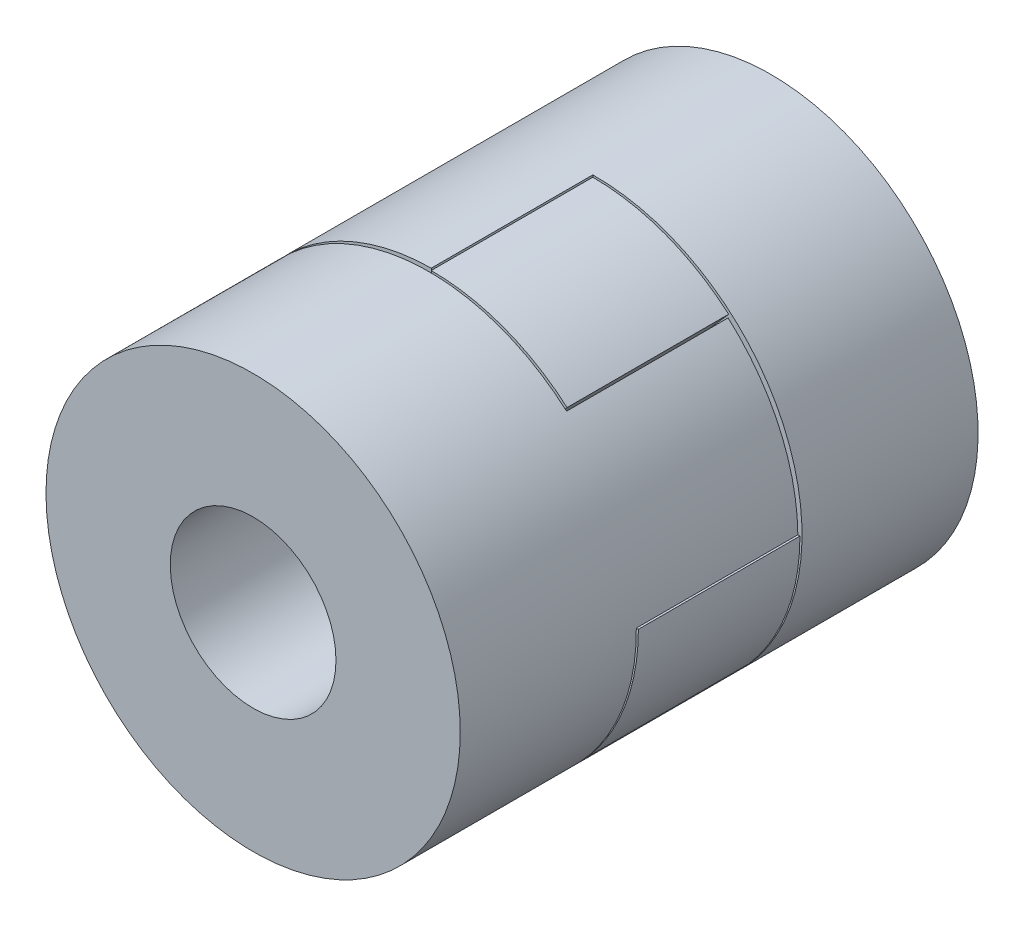
ISO-10303-21;
HEADER;
FILE_DESCRIPTION(('STEP AP214'),'2;1');
FILE_NAME('part.step','',(''),(''),'','','');
FILE_SCHEMA(('AUTOMOTIVE_DESIGN { 1 0 10303 214 1 1 1 1 }'));
ENDSEC;
DATA;
#1=APPLICATION_CONTEXT('core data for automotive mechanical design processes');
#2=APPLICATION_PROTOCOL_DEFINITION('international standard','automotive_design',2000,#1);
#3=PRODUCT_CONTEXT('',#1,'mechanical');
#4=PRODUCT('Part','Part','',(#3));
#5=PRODUCT_RELATED_PRODUCT_CATEGORY('part','',(#4));
#6=PRODUCT_DEFINITION_FORMATION('','',#4);
#7=PRODUCT_DEFINITION_CONTEXT('part definition',#1,'design');
#8=PRODUCT_DEFINITION('design','',#6,#7);
#9=PRODUCT_DEFINITION_SHAPE('','',#8);
#10=(LENGTH_UNIT() NAMED_UNIT(*) SI_UNIT(.MILLI.,.METRE.));
#11=(NAMED_UNIT(*) PLANE_ANGLE_UNIT() SI_UNIT($,.RADIAN.));
#12=(NAMED_UNIT(*) SI_UNIT($,.STERADIAN.) SOLID_ANGLE_UNIT());
#13=UNCERTAINTY_MEASURE_WITH_UNIT(LENGTH_MEASURE(1.E-05),#10,'distance_accuracy_value','');
#14=(GEOMETRIC_REPRESENTATION_CONTEXT(3) GLOBAL_UNCERTAINTY_ASSIGNED_CONTEXT((#13)) GLOBAL_UNIT_ASSIGNED_CONTEXT((#10,
#11,#12)) REPRESENTATION_CONTEXT('',''));
#15=CARTESIAN_POINT('',(0.,0.,0.));
#16=DIRECTION('',(0.,0.,1.));
#17=DIRECTION('',(1.,0.,0.));
#18=AXIS2_PLACEMENT_3D('',#15,#16,#17);
#19=CARTESIAN_POINT('',(0.,0.,-4.));
#20=DIRECTION('',(0.,0.,-1.));
#21=DIRECTION('',(-1.,0.,0.));
#22=AXIS2_PLACEMENT_3D('',#19,#20,#21);
#23=PLANE('',#22);
#24=DIRECTION('',(0.754999999999998,-0.655724789831835,0.));
#25=VECTOR('',#24,1.);
#26=CARTESIAN_POINT('',(-0.0999999999999948,0.219301296666478,-4.));
#27=LINE('',#26,#25);
#28=CARTESIAN_POINT('',(-7.48405001157881,6.63242002772647,-4.));
#29=VERTEX_POINT('',#28);
#30=CARTESIAN_POINT('',(-1.82041691653312,1.71350000000001,-4.));
#31=VERTEX_POINT('',#30);
#32=EDGE_CURVE('E125',#29,#31,#27,.T.);
#33=ORIENTED_EDGE('',*,*,#32,.F.);
#34=CARTESIAN_POINT('',(0.,0.,-4.));
#35=DIRECTION('',(0.,0.,-1.));
#36=DIRECTION('',(-1.,0.,0.));
#37=AXIS2_PLACEMENT_3D('',#34,#35,#36);
#38=CIRCLE('',#37,10.);
#39=CARTESIAN_POINT('',(0.100000000000002,-9.99949998749938,-4.));
#40=VERTEX_POINT('',#39);
#41=EDGE_CURVE('E96',#40,#29,#38,.T.);
#42=ORIENTED_EDGE('',*,*,#41,.F.);
#43=DIRECTION('',(0.,-1.,0.));
#44=VECTOR('',#43,1.);
#45=CARTESIAN_POINT('',(0.1,-0.219301296666469,-4.));
#46=LINE('',#45,#44);
#47=CARTESIAN_POINT('',(0.100000000000001,-2.49799919935936,-4.));
#48=VERTEX_POINT('',#47);
#49=EDGE_CURVE('E13',#48,#40,#46,.T.);
#50=ORIENTED_EDGE('',*,*,#49,.F.);
#51=CARTESIAN_POINT('',(0.,0.,-4.));
#52=DIRECTION('',(0.,0.,-1.));
#53=DIRECTION('',(-1.,0.,0.));
#54=AXIS2_PLACEMENT_3D('',#51,#52,#53);
#55=CIRCLE('',#54,2.5);
#56=EDGE_CURVE('E245',#48,#31,#55,.T.);
#57=ORIENTED_EDGE('',*,*,#56,.T.);
#58=EDGE_LOOP('',(#33,#42,#50,#57));
#59=FACE_BOUND('',#58,.T.);
#60=ADVANCED_FACE('F92',(#59),#23,.F.);
#61=DIRECTION('',(0.,1.,0.));
#62=VECTOR('',#61,1.);
#63=CARTESIAN_POINT('',(-0.0999999999999948,0.219301296666478,-4.));
#64=LINE('',#63,#62);
#65=CARTESIAN_POINT('',(-0.0999999999999935,2.49799919935936,-4.));
#66=VERTEX_POINT('',#65);
#67=CARTESIAN_POINT('',(-0.0999999999999889,9.99949998749938,-4.));
#68=VERTEX_POINT('',#67);
#69=EDGE_CURVE('E353',#66,#68,#64,.T.);
#70=ORIENTED_EDGE('',*,*,#69,.F.);
#71=CARTESIAN_POINT('',(1.82041691653313,-1.71350000000001,-4.));
#72=VERTEX_POINT('',#71);
#73=EDGE_CURVE('E237',#66,#72,#55,.T.);
#74=ORIENTED_EDGE('',*,*,#73,.T.);
#75=DIRECTION('',(-0.754999999999998,0.655724789831834,0.));
#76=VECTOR('',#75,1.);
#77=CARTESIAN_POINT('',(0.1,-0.219301296666469,-4.));
#78=LINE('',#77,#76);
#79=CARTESIAN_POINT('',(7.48405001157882,-6.63242002772646,-4.));
#80=VERTEX_POINT('',#79);
#81=EDGE_CURVE('E206',#80,#72,#78,.T.);
#82=ORIENTED_EDGE('',*,*,#81,.F.);
#83=EDGE_CURVE('E114',#68,#80,#38,.T.);
#84=ORIENTED_EDGE('',*,*,#83,.F.);
#85=EDGE_LOOP('',(#70,#74,#82,#84));
#86=FACE_BOUND('',#85,.T.);
#87=ADVANCED_FACE('F254',(#86),#23,.F.);
#88=CARTESIAN_POINT('',(0.,0.,-12.5));
#89=DIRECTION('',(0.,0.,-1.));
#90=DIRECTION('',(-1.,0.,0.));
#91=AXIS2_PLACEMENT_3D('',#88,#89,#90);
#92=PLANE('',#91);
#93=CARTESIAN_POINT('',(0.,0.,-12.5));
#94=DIRECTION('',(0.,0.,-1.));
#95=DIRECTION('',(-1.,0.,0.));
#96=AXIS2_PLACEMENT_3D('',#93,#94,#95);
#97=CIRCLE('',#96,10.);
#98=CARTESIAN_POINT('',(-10.,0.,-12.5));
#99=VERTEX_POINT('',#98);
#100=EDGE_CURVE('E102',#99,#99,#97,.T.);
#101=ORIENTED_EDGE('',*,*,#100,.T.);
#102=EDGE_LOOP('',(#101));
#103=FACE_BOUND('',#102,.T.);
#104=CARTESIAN_POINT('',(0.,0.,-12.5));
#105=DIRECTION('',(0.,0.,-1.));
#106=DIRECTION('',(-1.,0.,0.));
#107=AXIS2_PLACEMENT_3D('',#104,#105,#106);
#108=CIRCLE('',#107,2.5);
#109=CARTESIAN_POINT('',(-2.5,0.,-12.5));
#110=VERTEX_POINT('',#109);
#111=EDGE_CURVE('E238',#110,#110,#108,.T.);
#112=ORIENTED_EDGE('',*,*,#111,.F.);
#113=EDGE_LOOP('',(#112));
#114=FACE_BOUND('',#113,.T.);
#115=ADVANCED_FACE('F291',(#103,#114),#92,.T.);
#116=CARTESIAN_POINT('',(0.,0.,-12.5));
#117=DIRECTION('',(0.,0.,1.));
#118=DIRECTION('',(1.,0.,0.));
#119=AXIS2_PLACEMENT_3D('',#116,#117,#118);
#120=CYLINDRICAL_SURFACE('',#119,10.);
#121=ORIENTED_EDGE('',*,*,#100,.F.);
#122=EDGE_LOOP('',(#121));
#123=FACE_BOUND('',#122,.T.);
#124=ORIENTED_EDGE('',*,*,#41,.T.);
#125=DIRECTION('',(0.,0.,-1.));
#126=VECTOR('',#125,1.);
#127=CARTESIAN_POINT('',(-7.48405001157882,6.63242002772647,3.8));
#128=LINE('',#127,#126);
#129=CARTESIAN_POINT('',(-7.48405001157882,6.63242002772647,3.8));
#130=VERTEX_POINT('',#129);
#131=EDGE_CURVE('E183',#130,#29,#128,.T.);
#132=ORIENTED_EDGE('',*,*,#131,.F.);
#133=CARTESIAN_POINT('',(0.,0.,3.8));
#134=DIRECTION('',(0.,0.,1.));
#135=DIRECTION('',(1.,0.,0.));
#136=AXIS2_PLACEMENT_3D('',#133,#134,#135);
#137=CIRCLE('',#136,10.);
#138=CARTESIAN_POINT('',(-0.099999999999989,9.99949998749938,3.8));
#139=VERTEX_POINT('',#138);
#140=EDGE_CURVE('E190',#139,#130,#137,.T.);
#141=ORIENTED_EDGE('',*,*,#140,.F.);
#142=DIRECTION('',(0.,0.,-1.));
#143=VECTOR('',#142,1.);
#144=CARTESIAN_POINT('',(-0.099999999999989,9.99949998749938,3.8));
#145=LINE('',#144,#143);
#146=EDGE_CURVE('E208',#139,#68,#145,.T.);
#147=ORIENTED_EDGE('',*,*,#146,.T.);
#148=ORIENTED_EDGE('',*,*,#83,.T.);
#149=DIRECTION('',(0.,0.,-1.));
#150=VECTOR('',#149,1.);
#151=CARTESIAN_POINT('',(7.48405001157882,-6.63242002772646,3.8));
#152=LINE('',#151,#150);
#153=CARTESIAN_POINT('',(7.48405001157882,-6.63242002772646,3.8));
#154=VERTEX_POINT('',#153);
#155=EDGE_CURVE('E233',#154,#80,#152,.T.);
#156=ORIENTED_EDGE('',*,*,#155,.F.);
#157=CARTESIAN_POINT('',(0.,0.,3.8));
#158=DIRECTION('',(0.,0.,1.));
#159=DIRECTION('',(-1.,0.,0.));
#160=AXIS2_PLACEMENT_3D('',#157,#158,#159);
#161=CIRCLE('',#160,10.);
#162=CARTESIAN_POINT('',(0.100000000000002,-9.99949998749938,3.8));
#163=VERTEX_POINT('',#162);
#164=EDGE_CURVE('E212',#163,#154,#161,.T.);
#165=ORIENTED_EDGE('',*,*,#164,.F.);
#166=DIRECTION('',(0.,0.,-1.));
#167=VECTOR('',#166,1.);
#168=CARTESIAN_POINT('',(0.100000000000002,-9.99949998749938,3.8));
#169=LINE('',#168,#167);
#170=EDGE_CURVE('E221',#163,#40,#169,.T.);
#171=ORIENTED_EDGE('',*,*,#170,.T.);
#172=EDGE_LOOP('',(#124,#132,#141,#147,#148,#156,#165,#171));
#173=FACE_BOUND('',#172,.T.);
#174=ADVANCED_FACE('F94',(#123,#173),#120,.T.);
#175=CARTESIAN_POINT('',(0.,0.,-12.5));
#176=DIRECTION('',(0.,0.,1.));
#177=DIRECTION('',(1.,0.,0.));
#178=AXIS2_PLACEMENT_3D('',#175,#176,#177);
#179=CYLINDRICAL_SURFACE('',#178,2.5);
#180=ORIENTED_EDGE('',*,*,#111,.T.);
#181=EDGE_LOOP('',(#180));
#182=FACE_BOUND('',#181,.T.);
#183=EDGE_CURVE('E242',#72,#48,#55,.T.);
#184=ORIENTED_EDGE('',*,*,#183,.F.);
#185=ORIENTED_EDGE('',*,*,#73,.F.);
#186=EDGE_CURVE('E272',#31,#66,#55,.T.);
#187=ORIENTED_EDGE('',*,*,#186,.F.);
#188=ORIENTED_EDGE('',*,*,#56,.F.);
#189=EDGE_LOOP('',(#184,#185,#187,#188));
#190=FACE_BOUND('',#189,.T.);
#191=ADVANCED_FACE('F269',(#182,#190),#179,.F.);
#192=CARTESIAN_POINT('',(0.1,-0.219301296666469,3.8));
#193=DIRECTION('',(-0.655724789831834,-0.754999999999998,0.));
#194=DIRECTION('',(0.754999999999998,-0.655724789831834,0.));
#195=AXIS2_PLACEMENT_3D('',#192,#193,#194);
#196=PLANE('',#195);
#197=ORIENTED_EDGE('',*,*,#81,.T.);
#198=CARTESIAN_POINT('',(0.1,-0.219301296666469,-4.));
#199=VERTEX_POINT('',#198);
#200=EDGE_CURVE('E202',#72,#199,#78,.T.);
#201=ORIENTED_EDGE('',*,*,#200,.T.);
#202=DIRECTION('',(0.,0.,-1.));
#203=VECTOR('',#202,1.);
#204=CARTESIAN_POINT('',(0.1,-0.219301296666469,3.8));
#205=LINE('',#204,#203);
#206=CARTESIAN_POINT('',(0.1,-0.219301296666469,3.8));
#207=VERTEX_POINT('',#206);
#208=EDGE_CURVE('E229',#207,#199,#205,.T.);
#209=ORIENTED_EDGE('',*,*,#208,.F.);
#210=DIRECTION('',(-0.754999999999998,0.655724789831834,0.));
#211=VECTOR('',#210,1.);
#212=CARTESIAN_POINT('',(0.1,-0.219301296666469,3.8));
#213=LINE('',#212,#211);
#214=EDGE_CURVE('E216',#154,#207,#213,.T.);
#215=ORIENTED_EDGE('',*,*,#214,.F.);
#216=ORIENTED_EDGE('',*,*,#155,.T.);
#217=EDGE_LOOP('',(#197,#201,#209,#215,#216));
#218=FACE_BOUND('',#217,.T.);
#219=ADVANCED_FACE('F257',(#218),#196,.F.);
#220=CARTESIAN_POINT('',(0.1,-0.219301296666469,3.8));
#221=DIRECTION('',(1.,0.,0.));
#222=DIRECTION('',(0.,1.,0.));
#223=AXIS2_PLACEMENT_3D('',#220,#221,#222);
#224=PLANE('',#223);
#225=EDGE_CURVE('E104',#199,#48,#46,.T.);
#226=ORIENTED_EDGE('',*,*,#225,.T.);
#227=ORIENTED_EDGE('',*,*,#49,.T.);
#228=ORIENTED_EDGE('',*,*,#170,.F.);
#229=DIRECTION('',(0.,-1.,0.));
#230=VECTOR('',#229,1.);
#231=CARTESIAN_POINT('',(0.1,-0.219301296666469,3.8));
#232=LINE('',#231,#230);
#233=EDGE_CURVE('E219',#207,#163,#232,.T.);
#234=ORIENTED_EDGE('',*,*,#233,.F.);
#235=ORIENTED_EDGE('',*,*,#208,.T.);
#236=EDGE_LOOP('',(#226,#227,#228,#234,#235));
#237=FACE_BOUND('',#236,.T.);
#238=ADVANCED_FACE('F264',(#237),#224,.F.);
#239=CARTESIAN_POINT('',(0.,0.,3.8));
#240=DIRECTION('',(0.,0.,-1.));
#241=DIRECTION('',(-1.,0.,0.));
#242=AXIS2_PLACEMENT_3D('',#239,#240,#241);
#243=PLANE('',#242);
#244=ORIENTED_EDGE('',*,*,#164,.T.);
#245=ORIENTED_EDGE('',*,*,#214,.T.);
#246=ORIENTED_EDGE('',*,*,#233,.T.);
#247=EDGE_LOOP('',(#244,#245,#246));
#248=FACE_BOUND('',#247,.T.);
#249=ADVANCED_FACE('F261',(#248),#243,.F.);
#250=CARTESIAN_POINT('',(0.,0.,-4.));
#251=DIRECTION('',(0.,0.,-1.));
#252=DIRECTION('',(-1.,0.,0.));
#253=AXIS2_PLACEMENT_3D('',#250,#251,#252);
#254=PLANE('',#253);
#255=ORIENTED_EDGE('',*,*,#200,.F.);
#256=ORIENTED_EDGE('',*,*,#183,.T.);
#257=ORIENTED_EDGE('',*,*,#225,.F.);
#258=EDGE_LOOP('',(#255,#256,#257));
#259=FACE_BOUND('',#258,.T.);
#260=ADVANCED_FACE('F275',(#259),#254,.T.);
#261=CARTESIAN_POINT('',(0.,0.,-4.));
#262=DIRECTION('',(0.,0.,1.));
#263=DIRECTION('',(1.,0.,0.));
#264=AXIS2_PLACEMENT_3D('',#261,#262,#263);
#265=PLANE('',#264);
#266=ORIENTED_EDGE('',*,*,#186,.T.);
#267=CARTESIAN_POINT('',(-0.0999999999999948,0.219301296666478,-4.));
#268=VERTEX_POINT('',#267);
#269=EDGE_CURVE('E198',#268,#66,#64,.T.);
#270=ORIENTED_EDGE('',*,*,#269,.F.);
#271=EDGE_CURVE('E362',#31,#268,#27,.T.);
#272=ORIENTED_EDGE('',*,*,#271,.F.);
#273=EDGE_LOOP('',(#266,#270,#272));
#274=FACE_BOUND('',#273,.T.);
#275=ADVANCED_FACE('F277',(#274),#265,.F.);
#276=CARTESIAN_POINT('',(-0.0999999999999948,0.219301296666478,3.8));
#277=DIRECTION('',(0.655724789831835,0.754999999999998,0.));
#278=DIRECTION('',(-0.754999999999998,0.655724789831835,0.));
#279=AXIS2_PLACEMENT_3D('',#276,#277,#278);
#280=PLANE('',#279);
#281=ORIENTED_EDGE('',*,*,#32,.T.);
#282=ORIENTED_EDGE('',*,*,#271,.T.);
#283=DIRECTION('',(0.,0.,-1.));
#284=VECTOR('',#283,1.);
#285=CARTESIAN_POINT('',(-0.0999999999999948,0.219301296666478,3.8));
#286=LINE('',#285,#284);
#287=CARTESIAN_POINT('',(-0.0999999999999948,0.219301296666478,3.8));
#288=VERTEX_POINT('',#287);
#289=EDGE_CURVE('E185',#288,#268,#286,.T.);
#290=ORIENTED_EDGE('',*,*,#289,.F.);
#291=DIRECTION('',(0.754999999999998,-0.655724789831835,0.));
#292=VECTOR('',#291,1.);
#293=CARTESIAN_POINT('',(-0.0999999999999948,0.219301296666478,3.8));
#294=LINE('',#293,#292);
#295=EDGE_CURVE('E179',#130,#288,#294,.T.);
#296=ORIENTED_EDGE('',*,*,#295,.F.);
#297=ORIENTED_EDGE('',*,*,#131,.T.);
#298=EDGE_LOOP('',(#281,#282,#290,#296,#297));
#299=FACE_BOUND('',#298,.T.);
#300=ADVANCED_FACE('F181',(#299),#280,.F.);
#301=CARTESIAN_POINT('',(-0.0999999999999948,0.219301296666478,3.8));
#302=DIRECTION('',(-1.,0.,0.));
#303=DIRECTION('',(0.,-1.,0.));
#304=AXIS2_PLACEMENT_3D('',#301,#302,#303);
#305=PLANE('',#304);
#306=ORIENTED_EDGE('',*,*,#269,.T.);
#307=ORIENTED_EDGE('',*,*,#69,.T.);
#308=ORIENTED_EDGE('',*,*,#146,.F.);
#309=DIRECTION('',(0.,1.,0.));
#310=VECTOR('',#309,1.);
#311=CARTESIAN_POINT('',(-0.0999999999999948,0.219301296666478,3.8));
#312=LINE('',#311,#310);
#313=EDGE_CURVE('E189',#288,#139,#312,.T.);
#314=ORIENTED_EDGE('',*,*,#313,.F.);
#315=ORIENTED_EDGE('',*,*,#289,.T.);
#316=EDGE_LOOP('',(#306,#307,#308,#314,#315));
#317=FACE_BOUND('',#316,.T.);
#318=ADVANCED_FACE('F329',(#317),#305,.F.);
#319=CARTESIAN_POINT('',(0.,0.,3.8));
#320=DIRECTION('',(0.,0.,1.));
#321=DIRECTION('',(1.,0.,0.));
#322=AXIS2_PLACEMENT_3D('',#319,#320,#321);
#323=PLANE('',#322);
#324=ORIENTED_EDGE('',*,*,#140,.T.);
#325=ORIENTED_EDGE('',*,*,#295,.T.);
#326=ORIENTED_EDGE('',*,*,#313,.T.);
#327=EDGE_LOOP('',(#324,#325,#326));
#328=FACE_BOUND('',#327,.T.);
#329=ADVANCED_FACE('F193',(#328),#323,.T.);
#330=CLOSED_SHELL('',(#60,#87,#115,#174,#191,#219,#238,#249,#260,#275,#300,#318,#329));
#331=MANIFOLD_SOLID_BREP('B2',#330);
#332=CARTESIAN_POINT('',(0.,0.,4.));
#333=DIRECTION('',(0.,0.,1.));
#334=DIRECTION('',(1.,0.,0.));
#335=AXIS2_PLACEMENT_3D('',#332,#333,#334);
#336=PLANE('',#335);
#337=DIRECTION('',(-1.,0.,0.));
#338=VECTOR('',#337,1.);
#339=CARTESIAN_POINT('',(0.219301296666467,0.100000000000001,4.));
#340=LINE('',#339,#338);
#341=CARTESIAN_POINT('',(9.99949998749938,0.100000000000001,4.));
#342=VERTEX_POINT('',#341);
#343=CARTESIAN_POINT('',(3.99874980462644,0.100000000000001,4.));
#344=VERTEX_POINT('',#343);
#345=EDGE_CURVE('E457',#342,#344,#340,.T.);
#346=ORIENTED_EDGE('',*,*,#345,.F.);
#347=CARTESIAN_POINT('',(0.,0.,4.));
#348=DIRECTION('',(0.,0.,1.));
#349=DIRECTION('',(1.,0.,0.));
#350=AXIS2_PLACEMENT_3D('',#347,#348,#349);
#351=CIRCLE('',#350,10.);
#352=CARTESIAN_POINT('',(-6.63242002772648,-7.48405001157881,4.));
#353=VERTEX_POINT('',#352);
#354=EDGE_CURVE('E428',#353,#342,#351,.T.);
#355=ORIENTED_EDGE('',*,*,#354,.F.);
#356=DIRECTION('',(-0.655724789831836,-0.754999999999997,0.));
#357=VECTOR('',#356,1.);
#358=CARTESIAN_POINT('',(-0.219301296666469,-0.0999999999999946,4.));
#359=LINE('',#358,#357);
#360=CARTESIAN_POINT('',(-2.69757937522877,-2.95348362350976,4.));
#361=VERTEX_POINT('',#360);
#362=EDGE_CURVE('E90',#361,#353,#359,.T.);
#363=ORIENTED_EDGE('',*,*,#362,.F.);
#364=CARTESIAN_POINT('',(0.,0.,4.));
#365=DIRECTION('',(0.,0.,1.));
#366=DIRECTION('',(1.,0.,0.));
#367=AXIS2_PLACEMENT_3D('',#364,#365,#366);
#368=CIRCLE('',#367,4.);
#369=EDGE_CURVE('E575',#361,#344,#368,.T.);
#370=ORIENTED_EDGE('',*,*,#369,.T.);
#371=EDGE_LOOP('',(#346,#355,#363,#370));
#372=FACE_BOUND('',#371,.T.);
#373=ADVANCED_FACE('F424',(#372),#336,.F.);
#374=DIRECTION('',(0.655724789831832,0.755,0.));
#375=VECTOR('',#374,1.);
#376=CARTESIAN_POINT('',(6.63242002772643,7.48405001157885,4.));
#377=LINE('',#376,#375);
#378=CARTESIAN_POINT('',(2.69757937522875,2.95348362350978,4.));
#379=VERTEX_POINT('',#378);
#380=CARTESIAN_POINT('',(6.63242002772643,7.48405001157885,4.));
#381=VERTEX_POINT('',#380);
#382=EDGE_CURVE('E730',#379,#381,#377,.T.);
#383=ORIENTED_EDGE('',*,*,#382,.F.);
#384=CARTESIAN_POINT('',(-3.99874980462644,-0.099999999999974,4.));
#385=VERTEX_POINT('',#384);
#386=EDGE_CURVE('E567',#379,#385,#368,.T.);
#387=ORIENTED_EDGE('',*,*,#386,.T.);
#388=DIRECTION('',(1.,0.,0.));
#389=VECTOR('',#388,1.);
#390=CARTESIAN_POINT('',(-9.99949998749938,-0.0999999999999413,4.));
#391=LINE('',#390,#389);
#392=CARTESIAN_POINT('',(-9.99949998749938,-0.0999999999999413,4.));
#393=VERTEX_POINT('',#392);
#394=EDGE_CURVE('E536',#393,#385,#391,.T.);
#395=ORIENTED_EDGE('',*,*,#394,.F.);
#396=EDGE_CURVE('E446',#381,#393,#351,.T.);
#397=ORIENTED_EDGE('',*,*,#396,.F.);
#398=EDGE_LOOP('',(#383,#387,#395,#397));
#399=FACE_BOUND('',#398,.T.);
#400=ADVANCED_FACE('F585',(#399),#336,.F.);
#401=CARTESIAN_POINT('',(0.,0.,12.5));
#402=DIRECTION('',(0.,0.,1.));
#403=DIRECTION('',(1.,0.,0.));
#404=AXIS2_PLACEMENT_3D('',#401,#402,#403);
#405=PLANE('',#404);
#406=CARTESIAN_POINT('',(0.,0.,12.5));
#407=DIRECTION('',(0.,0.,1.));
#408=DIRECTION('',(1.,0.,0.));
#409=AXIS2_PLACEMENT_3D('',#406,#407,#408);
#410=CIRCLE('',#409,10.);
#411=CARTESIAN_POINT('',(10.,0.,12.5));
#412=VERTEX_POINT('',#411);
#413=EDGE_CURVE('E434',#412,#412,#410,.T.);
#414=ORIENTED_EDGE('',*,*,#413,.T.);
#415=EDGE_LOOP('',(#414));
#416=FACE_BOUND('',#415,.T.);
#417=CARTESIAN_POINT('',(0.,0.,12.5));
#418=DIRECTION('',(0.,0.,1.));
#419=DIRECTION('',(1.,0.,0.));
#420=AXIS2_PLACEMENT_3D('',#417,#418,#419);
#421=CIRCLE('',#420,4.);
#422=CARTESIAN_POINT('',(4.,0.,12.5));
#423=VERTEX_POINT('',#422);
#424=EDGE_CURVE('E568',#423,#423,#421,.T.);
#425=ORIENTED_EDGE('',*,*,#424,.F.);
#426=EDGE_LOOP('',(#425));
#427=FACE_BOUND('',#426,.T.);
#428=ADVANCED_FACE('F622',(#416,#427),#405,.T.);
#429=CARTESIAN_POINT('',(0.,0.,12.5));
#430=DIRECTION('',(0.,0.,-1.));
#431=DIRECTION('',(-1.,0.,0.));
#432=AXIS2_PLACEMENT_3D('',#429,#430,#431);
#433=CYLINDRICAL_SURFACE('',#432,10.);
#434=ORIENTED_EDGE('',*,*,#413,.F.);
#435=EDGE_LOOP('',(#434));
#436=FACE_BOUND('',#435,.T.);
#437=ORIENTED_EDGE('',*,*,#354,.T.);
#438=DIRECTION('',(0.,0.,1.));
#439=VECTOR('',#438,1.);
#440=CARTESIAN_POINT('',(9.99949998749938,0.100000000000001,-3.8));
#441=LINE('',#440,#439);
#442=CARTESIAN_POINT('',(9.99949998749938,0.100000000000001,-3.8));
#443=VERTEX_POINT('',#442);
#444=EDGE_CURVE('E513',#443,#342,#441,.T.);
#445=ORIENTED_EDGE('',*,*,#444,.F.);
#446=CARTESIAN_POINT('',(0.,0.,-3.8));
#447=DIRECTION('',(0.,0.,-1.));
#448=DIRECTION('',(-1.,0.,0.));
#449=AXIS2_PLACEMENT_3D('',#446,#447,#448);
#450=CIRCLE('',#449,10.);
#451=CARTESIAN_POINT('',(6.63242002772643,7.48405001157885,-3.8));
#452=VERTEX_POINT('',#451);
#453=EDGE_CURVE('E520',#452,#443,#450,.T.);
#454=ORIENTED_EDGE('',*,*,#453,.F.);
#455=DIRECTION('',(0.,0.,1.));
#456=VECTOR('',#455,1.);
#457=CARTESIAN_POINT('',(6.63242002772643,7.48405001157885,-3.8));
#458=LINE('',#457,#456);
#459=EDGE_CURVE('E539',#452,#381,#458,.T.);
#460=ORIENTED_EDGE('',*,*,#459,.T.);
#461=ORIENTED_EDGE('',*,*,#396,.T.);
#462=DIRECTION('',(0.,0.,1.));
#463=VECTOR('',#462,1.);
#464=CARTESIAN_POINT('',(-9.99949998749938,-0.0999999999999413,-3.8));
#465=LINE('',#464,#463);
#466=CARTESIAN_POINT('',(-9.99949998749938,-0.0999999999999413,-3.8));
#467=VERTEX_POINT('',#466);
#468=EDGE_CURVE('E564',#467,#393,#465,.T.);
#469=ORIENTED_EDGE('',*,*,#468,.F.);
#470=CARTESIAN_POINT('',(0.,0.,-3.8));
#471=DIRECTION('',(0.,0.,-1.));
#472=DIRECTION('',(1.,0.,0.));
#473=AXIS2_PLACEMENT_3D('',#470,#471,#472);
#474=CIRCLE('',#473,10.);
#475=CARTESIAN_POINT('',(-6.63242002772647,-7.48405001157881,-3.8));
#476=VERTEX_POINT('',#475);
#477=EDGE_CURVE('E543',#476,#467,#474,.T.);
#478=ORIENTED_EDGE('',*,*,#477,.F.);
#479=DIRECTION('',(0.,0.,1.));
#480=VECTOR('',#479,1.);
#481=CARTESIAN_POINT('',(-6.63242002772647,-7.48405001157881,-3.8));
#482=LINE('',#481,#480);
#483=EDGE_CURVE('E552',#476,#353,#482,.T.);
#484=ORIENTED_EDGE('',*,*,#483,.T.);
#485=EDGE_LOOP('',(#437,#445,#454,#460,#461,#469,#478,#484));
#486=FACE_BOUND('',#485,.T.);
#487=ADVANCED_FACE('F426',(#436,#486),#433,.T.);
#488=CARTESIAN_POINT('',(0.,0.,12.5));
#489=DIRECTION('',(0.,0.,-1.));
#490=DIRECTION('',(-1.,0.,0.));
#491=AXIS2_PLACEMENT_3D('',#488,#489,#490);
#492=CYLINDRICAL_SURFACE('',#491,4.);
#493=ORIENTED_EDGE('',*,*,#424,.T.);
#494=EDGE_LOOP('',(#493));
#495=FACE_BOUND('',#494,.T.);
#496=EDGE_CURVE('E572',#385,#361,#368,.T.);
#497=ORIENTED_EDGE('',*,*,#496,.F.);
#498=ORIENTED_EDGE('',*,*,#386,.F.);
#499=EDGE_CURVE('E603',#344,#379,#368,.T.);
#500=ORIENTED_EDGE('',*,*,#499,.F.);
#501=ORIENTED_EDGE('',*,*,#369,.F.);
#502=EDGE_LOOP('',(#497,#498,#500,#501));
#503=FACE_BOUND('',#502,.T.);
#504=ADVANCED_FACE('F600',(#495,#503),#492,.F.);
#505=CARTESIAN_POINT('',(-9.99949998749938,-0.0999999999999413,-3.8));
#506=DIRECTION('',(0.,-1.,0.));
#507=DIRECTION('',(1.,0.,0.));
#508=AXIS2_PLACEMENT_3D('',#505,#506,#507);
#509=PLANE('',#508);
#510=ORIENTED_EDGE('',*,*,#394,.T.);
#511=CARTESIAN_POINT('',(-0.219301296666469,-0.0999999999999946,4.));
#512=VERTEX_POINT('',#511);
#513=EDGE_CURVE('E531',#385,#512,#391,.T.);
#514=ORIENTED_EDGE('',*,*,#513,.T.);
#515=DIRECTION('',(0.,0.,1.));
#516=VECTOR('',#515,1.);
#517=CARTESIAN_POINT('',(-0.219301296666469,-0.0999999999999946,-3.8));
#518=LINE('',#517,#516);
#519=CARTESIAN_POINT('',(-0.219301296666469,-0.0999999999999946,-3.8));
#520=VERTEX_POINT('',#519);
#521=EDGE_CURVE('E560',#520,#512,#518,.T.);
#522=ORIENTED_EDGE('',*,*,#521,.F.);
#523=DIRECTION('',(1.,0.,0.));
#524=VECTOR('',#523,1.);
#525=CARTESIAN_POINT('',(-9.99949998749938,-0.0999999999999413,-3.8));
#526=LINE('',#525,#524);
#527=EDGE_CURVE('E547',#467,#520,#526,.T.);
#528=ORIENTED_EDGE('',*,*,#527,.F.);
#529=ORIENTED_EDGE('',*,*,#468,.T.);
#530=EDGE_LOOP('',(#510,#514,#522,#528,#529));
#531=FACE_BOUND('',#530,.T.);
#532=ADVANCED_FACE('F588',(#531),#509,.F.);
#533=CARTESIAN_POINT('',(-0.219301296666469,-0.0999999999999946,-3.8));
#534=DIRECTION('',(-0.754999999999997,0.655724789831836,0.));
#535=DIRECTION('',(-0.655724789831836,-0.754999999999997,0.));
#536=AXIS2_PLACEMENT_3D('',#533,#534,#535);
#537=PLANE('',#536);
#538=EDGE_CURVE('E436',#512,#361,#359,.T.);
#539=ORIENTED_EDGE('',*,*,#538,.T.);
#540=ORIENTED_EDGE('',*,*,#362,.T.);
#541=ORIENTED_EDGE('',*,*,#483,.F.);
#542=DIRECTION('',(-0.655724789831836,-0.754999999999997,0.));
#543=VECTOR('',#542,1.);
#544=CARTESIAN_POINT('',(-0.219301296666469,-0.0999999999999946,-3.8));
#545=LINE('',#544,#543);
#546=EDGE_CURVE('E550',#520,#476,#545,.T.);
#547=ORIENTED_EDGE('',*,*,#546,.F.);
#548=ORIENTED_EDGE('',*,*,#521,.T.);
#549=EDGE_LOOP('',(#539,#540,#541,#547,#548));
#550=FACE_BOUND('',#549,.T.);
#551=ADVANCED_FACE('F595',(#550),#537,.F.);
#552=CARTESIAN_POINT('',(0.,0.,-3.8));
#553=DIRECTION('',(0.,0.,1.));
#554=DIRECTION('',(1.,0.,0.));
#555=AXIS2_PLACEMENT_3D('',#552,#553,#554);
#556=PLANE('',#555);
#557=ORIENTED_EDGE('',*,*,#477,.T.);
#558=ORIENTED_EDGE('',*,*,#527,.T.);
#559=ORIENTED_EDGE('',*,*,#546,.T.);
#560=EDGE_LOOP('',(#557,#558,#559));
#561=FACE_BOUND('',#560,.T.);
#562=ADVANCED_FACE('F592',(#561),#556,.F.);
#563=CARTESIAN_POINT('',(0.,0.,4.));
#564=DIRECTION('',(0.,0.,1.));
#565=DIRECTION('',(1.,0.,0.));
#566=AXIS2_PLACEMENT_3D('',#563,#564,#565);
#567=PLANE('',#566);
#568=ORIENTED_EDGE('',*,*,#513,.F.);
#569=ORIENTED_EDGE('',*,*,#496,.T.);
#570=ORIENTED_EDGE('',*,*,#538,.F.);
#571=EDGE_LOOP('',(#568,#569,#570));
#572=FACE_BOUND('',#571,.T.);
#573=ADVANCED_FACE('F606',(#572),#567,.T.);
#574=CARTESIAN_POINT('',(0.,0.,4.));
#575=DIRECTION('',(0.,0.,-1.));
#576=DIRECTION('',(-1.,0.,0.));
#577=AXIS2_PLACEMENT_3D('',#574,#575,#576);
#578=PLANE('',#577);
#579=ORIENTED_EDGE('',*,*,#499,.T.);
#580=CARTESIAN_POINT('',(0.219301296666467,0.100000000000001,4.));
#581=VERTEX_POINT('',#580);
#582=EDGE_CURVE('E527',#581,#379,#377,.T.);
#583=ORIENTED_EDGE('',*,*,#582,.F.);
#584=EDGE_CURVE('E738',#344,#581,#340,.T.);
#585=ORIENTED_EDGE('',*,*,#584,.F.);
#586=EDGE_LOOP('',(#579,#583,#585));
#587=FACE_BOUND('',#586,.T.);
#588=ADVANCED_FACE('F608',(#587),#578,.F.);
#589=CARTESIAN_POINT('',(0.219301296666467,0.100000000000001,-3.8));
#590=DIRECTION('',(0.,1.,0.));
#591=DIRECTION('',(0.,0.,1.));
#592=AXIS2_PLACEMENT_3D('',#589,#590,#591);
#593=PLANE('',#592);
#594=ORIENTED_EDGE('',*,*,#345,.T.);
#595=ORIENTED_EDGE('',*,*,#584,.T.);
#596=DIRECTION('',(0.,0.,1.));
#597=VECTOR('',#596,1.);
#598=CARTESIAN_POINT('',(0.219301296666467,0.100000000000001,-3.8));
#599=LINE('',#598,#597);
#600=CARTESIAN_POINT('',(0.219301296666467,0.100000000000001,-3.8));
#601=VERTEX_POINT('',#600);
#602=EDGE_CURVE('E515',#601,#581,#599,.T.);
#603=ORIENTED_EDGE('',*,*,#602,.F.);
#604=DIRECTION('',(-1.,0.,0.));
#605=VECTOR('',#604,1.);
#606=CARTESIAN_POINT('',(0.219301296666467,0.100000000000001,-3.8));
#607=LINE('',#606,#605);
#608=EDGE_CURVE('E509',#443,#601,#607,.T.);
#609=ORIENTED_EDGE('',*,*,#608,.F.);
#610=ORIENTED_EDGE('',*,*,#444,.T.);
#611=EDGE_LOOP('',(#594,#595,#603,#609,#610));
#612=FACE_BOUND('',#611,.T.);
#613=ADVANCED_FACE('F511',(#612),#593,.F.);
#614=CARTESIAN_POINT('',(6.63242002772643,7.48405001157885,-3.8));
#615=DIRECTION('',(0.755,-0.655724789831832,0.));
#616=DIRECTION('',(0.655724789831832,0.755,0.));
#617=AXIS2_PLACEMENT_3D('',#614,#615,#616);
#618=PLANE('',#617);
#619=ORIENTED_EDGE('',*,*,#582,.T.);
#620=ORIENTED_EDGE('',*,*,#382,.T.);
#621=ORIENTED_EDGE('',*,*,#459,.F.);
#622=DIRECTION('',(0.655724789831832,0.755,0.));
#623=VECTOR('',#622,1.);
#624=CARTESIAN_POINT('',(6.63242002772643,7.48405001157885,-3.8));
#625=LINE('',#624,#623);
#626=EDGE_CURVE('E519',#601,#452,#625,.T.);
#627=ORIENTED_EDGE('',*,*,#626,.F.);
#628=ORIENTED_EDGE('',*,*,#602,.T.);
#629=EDGE_LOOP('',(#619,#620,#621,#627,#628));
#630=FACE_BOUND('',#629,.T.);
#631=ADVANCED_FACE('F659',(#630),#618,.F.);
#632=CARTESIAN_POINT('',(0.,0.,-3.8));
#633=DIRECTION('',(0.,0.,-1.));
#634=DIRECTION('',(-1.,0.,0.));
#635=AXIS2_PLACEMENT_3D('',#632,#633,#634);
#636=PLANE('',#635);
#637=ORIENTED_EDGE('',*,*,#453,.T.);
#638=ORIENTED_EDGE('',*,*,#608,.T.);
#639=ORIENTED_EDGE('',*,*,#626,.T.);
#640=EDGE_LOOP('',(#637,#638,#639));
#641=FACE_BOUND('',#640,.T.);
#642=ADVANCED_FACE('F523',(#641),#636,.T.);
#643=CLOSED_SHELL('',(#373,#400,#428,#487,#504,#532,#551,#562,#573,#588,#613,#631,#642));
#644=MANIFOLD_SOLID_BREP('B7',#643);
#645=CARTESIAN_POINT('',(0.,0.,3.9));
#646=DIRECTION('',(0.,0.,-1.));
#647=DIRECTION('',(-1.,0.,0.));
#648=AXIS2_PLACEMENT_3D('',#645,#646,#647);
#649=CYLINDRICAL_SURFACE('',#648,10.);
#650=CARTESIAN_POINT('',(0.,0.,-3.9));
#651=DIRECTION('',(0.,0.,1.));
#652=DIRECTION('',(1.,0.,0.));
#653=AXIS2_PLACEMENT_3D('',#650,#651,#652);
#654=CIRCLE('',#653,10.);
#655=CARTESIAN_POINT('',(-10.,1.04744440165294E-13,-3.9));
#656=VERTEX_POINT('',#655);
#657=CARTESIAN_POINT('',(-7.54999999999993,6.5572478983184,-3.9));
#658=VERTEX_POINT('',#657);
#659=EDGE_CURVE('E798',#656,#658,#654,.F.);
#660=ORIENTED_EDGE('',*,*,#659,.F.);
#661=DIRECTION('',(0.,0.,-1.));
#662=VECTOR('',#661,1.);
#663=CARTESIAN_POINT('',(-10.,1.04744440165294E-13,3.9));
#664=LINE('',#663,#662);
#665=CARTESIAN_POINT('',(-10.,1.04744440165294E-13,3.9));
#666=VERTEX_POINT('',#665);
#667=EDGE_CURVE('E422',#666,#656,#664,.T.);
#668=ORIENTED_EDGE('',*,*,#667,.F.);
#669=CARTESIAN_POINT('',(0.,0.,3.9));
#670=DIRECTION('',(0.,0.,1.));
#671=DIRECTION('',(1.,0.,0.));
#672=AXIS2_PLACEMENT_3D('',#669,#670,#671);
#673=CIRCLE('',#672,10.);
#674=CARTESIAN_POINT('',(-7.54999999999993,6.5572478983184,3.9));
#675=VERTEX_POINT('',#674);
#676=EDGE_CURVE('E796',#666,#675,#673,.F.);
#677=ORIENTED_EDGE('',*,*,#676,.T.);
#678=DIRECTION('',(0.,0.,-1.));
#679=VECTOR('',#678,1.);
#680=CARTESIAN_POINT('',(-7.54999999999993,6.5572478983184,3.9));
#681=LINE('',#680,#679);
#682=EDGE_CURVE('E775',#675,#658,#681,.T.);
#683=ORIENTED_EDGE('',*,*,#682,.T.);
#684=EDGE_LOOP('',(#660,#668,#677,#683));
#685=FACE_BOUND('',#684,.T.);
#686=ADVANCED_FACE('F756',(#685),#649,.T.);
#687=CARTESIAN_POINT('',(0.,0.,3.9));
#688=DIRECTION('',(0.,1.,0.));
#689=DIRECTION('',(-1.,0.,0.));
#690=AXIS2_PLACEMENT_3D('',#687,#688,#689);
#691=PLANE('',#690);
#692=DIRECTION('',(1.,0.,0.));
#693=VECTOR('',#692,1.);
#694=CARTESIAN_POINT('',(0.,0.,-3.9));
#695=LINE('',#694,#693);
#696=CARTESIAN_POINT('',(0.,0.,-3.9));
#697=VERTEX_POINT('',#696);
#698=EDGE_CURVE('E815',#656,#697,#695,.T.);
#699=ORIENTED_EDGE('',*,*,#698,.T.);
#700=DIRECTION('',(0.,0.,-1.));
#701=VECTOR('',#700,1.);
#702=CARTESIAN_POINT('',(0.,0.,3.9));
#703=LINE('',#702,#701);
#704=CARTESIAN_POINT('',(0.,0.,3.9));
#705=VERTEX_POINT('',#704);
#706=EDGE_CURVE('E765',#705,#697,#703,.T.);
#707=ORIENTED_EDGE('',*,*,#706,.F.);
#708=DIRECTION('',(1.,0.,0.));
#709=VECTOR('',#708,1.);
#710=CARTESIAN_POINT('',(0.,0.,3.9));
#711=LINE('',#710,#709);
#712=EDGE_CURVE('E801',#666,#705,#711,.T.);
#713=ORIENTED_EDGE('',*,*,#712,.F.);
#714=ORIENTED_EDGE('',*,*,#667,.T.);
#715=EDGE_LOOP('',(#699,#707,#713,#714));
#716=FACE_BOUND('',#715,.T.);
#717=ADVANCED_FACE('F802',(#716),#691,.F.);
#718=CARTESIAN_POINT('',(0.,0.,3.9));
#719=DIRECTION('',(0.65572478983184,0.754999999999993,0.));
#720=DIRECTION('',(-0.754999999999993,0.65572478983184,0.));
#721=AXIS2_PLACEMENT_3D('',#718,#719,#720);
#722=PLANE('',#721);
#723=DIRECTION('',(0.754999999999993,-0.65572478983184,0.));
#724=VECTOR('',#723,1.);
#725=CARTESIAN_POINT('',(0.,0.,-3.9));
#726=LINE('',#725,#724);
#727=EDGE_CURVE('E809',#658,#697,#726,.T.);
#728=ORIENTED_EDGE('',*,*,#727,.F.);
#729=ORIENTED_EDGE('',*,*,#682,.F.);
#730=DIRECTION('',(0.754999999999993,-0.65572478983184,0.));
#731=VECTOR('',#730,1.);
#732=CARTESIAN_POINT('',(0.,0.,3.9));
#733=LINE('',#732,#731);
#734=EDGE_CURVE('E805',#675,#705,#733,.T.);
#735=ORIENTED_EDGE('',*,*,#734,.T.);
#736=ORIENTED_EDGE('',*,*,#706,.T.);
#737=EDGE_LOOP('',(#728,#729,#735,#736));
#738=FACE_BOUND('',#737,.T.);
#739=ADVANCED_FACE('F826',(#738),#722,.T.);
#740=CARTESIAN_POINT('',(0.,0.,3.9));
#741=DIRECTION('',(0.,0.,1.));
#742=DIRECTION('',(1.,0.,0.));
#743=AXIS2_PLACEMENT_3D('',#740,#741,#742);
#744=PLANE('',#743);
#745=ORIENTED_EDGE('',*,*,#676,.F.);
#746=ORIENTED_EDGE('',*,*,#712,.T.);
#747=ORIENTED_EDGE('',*,*,#734,.F.);
#748=EDGE_LOOP('',(#745,#746,#747));
#749=FACE_BOUND('',#748,.T.);
#750=ADVANCED_FACE('F807',(#749),#744,.T.);
#751=CARTESIAN_POINT('',(0.,0.,-3.9));
#752=DIRECTION('',(0.,0.,1.));
#753=DIRECTION('',(1.,0.,0.));
#754=AXIS2_PLACEMENT_3D('',#751,#752,#753);
#755=PLANE('',#754);
#756=ORIENTED_EDGE('',*,*,#659,.T.);
#757=ORIENTED_EDGE('',*,*,#727,.T.);
#758=ORIENTED_EDGE('',*,*,#698,.F.);
#759=EDGE_LOOP('',(#756,#757,#758));
#760=FACE_BOUND('',#759,.T.);
#761=ADVANCED_FACE('F825',(#760),#755,.F.);
#762=CLOSED_SHELL('',(#686,#717,#739,#750,#761));
#763=MANIFOLD_SOLID_BREP('B84',#762);
#764=CARTESIAN_POINT('',(0.,0.,3.9));
#765=DIRECTION('',(0.,0.,-1.));
#766=DIRECTION('',(-1.,0.,0.));
#767=AXIS2_PLACEMENT_3D('',#764,#765,#766);
#768=CYLINDRICAL_SURFACE('',#767,10.);
#769=CARTESIAN_POINT('',(0.,0.,-3.9));
#770=DIRECTION('',(0.,0.,1.));
#771=DIRECTION('',(1.,0.,0.));
#772=AXIS2_PLACEMENT_3D('',#769,#770,#771);
#773=CIRCLE('',#772,10.);
#774=CARTESIAN_POINT('',(0.,-10.,-3.9));
#775=VERTEX_POINT('',#774);
#776=CARTESIAN_POINT('',(-6.55724789831837,-7.54999999999995,-3.9));
#777=VERTEX_POINT('',#776);
#778=EDGE_CURVE('E921',#775,#777,#773,.F.);
#779=ORIENTED_EDGE('',*,*,#778,.F.);
#780=DIRECTION('',(0.,0.,-1.));
#781=VECTOR('',#780,1.);
#782=CARTESIAN_POINT('',(0.,-10.,3.9));
#783=LINE('',#782,#781);
#784=CARTESIAN_POINT('',(0.,-10.,3.9));
#785=VERTEX_POINT('',#784);
#786=EDGE_CURVE('E754',#785,#775,#783,.T.);
#787=ORIENTED_EDGE('',*,*,#786,.F.);
#788=CARTESIAN_POINT('',(0.,0.,3.9));
#789=DIRECTION('',(0.,0.,1.));
#790=DIRECTION('',(1.,0.,0.));
#791=AXIS2_PLACEMENT_3D('',#788,#789,#790);
#792=CIRCLE('',#791,10.);
#793=CARTESIAN_POINT('',(-6.55724789831837,-7.54999999999995,3.9));
#794=VERTEX_POINT('',#793);
#795=EDGE_CURVE('E919',#785,#794,#792,.F.);
#796=ORIENTED_EDGE('',*,*,#795,.T.);
#797=DIRECTION('',(0.,0.,-1.));
#798=VECTOR('',#797,1.);
#799=CARTESIAN_POINT('',(-6.55724789831837,-7.54999999999995,3.9));
#800=LINE('',#799,#798);
#801=EDGE_CURVE('E900',#794,#777,#800,.T.);
#802=ORIENTED_EDGE('',*,*,#801,.T.);
#803=EDGE_LOOP('',(#779,#787,#796,#802));
#804=FACE_BOUND('',#803,.T.);
#805=ADVANCED_FACE('F880',(#804),#768,.T.);
#806=CARTESIAN_POINT('',(0.,0.,3.9));
#807=DIRECTION('',(-1.,0.,0.));
#808=DIRECTION('',(0.,-1.,0.));
#809=AXIS2_PLACEMENT_3D('',#806,#807,#808);
#810=PLANE('',#809);
#811=DIRECTION('',(0.,1.,0.));
#812=VECTOR('',#811,1.);
#813=CARTESIAN_POINT('',(0.,0.,-3.9));
#814=LINE('',#813,#812);
#815=CARTESIAN_POINT('',(0.,0.,-3.9));
#816=VERTEX_POINT('',#815);
#817=EDGE_CURVE('E937',#775,#816,#814,.T.);
#818=ORIENTED_EDGE('',*,*,#817,.T.);
#819=DIRECTION('',(0.,0.,-1.));
#820=VECTOR('',#819,1.);
#821=CARTESIAN_POINT('',(0.,0.,3.9));
#822=LINE('',#821,#820);
#823=CARTESIAN_POINT('',(0.,0.,3.9));
#824=VERTEX_POINT('',#823);
#825=EDGE_CURVE('E889',#824,#816,#822,.T.);
#826=ORIENTED_EDGE('',*,*,#825,.F.);
#827=DIRECTION('',(0.,1.,0.));
#828=VECTOR('',#827,1.);
#829=CARTESIAN_POINT('',(0.,0.,3.9));
#830=LINE('',#829,#828);
#831=EDGE_CURVE('E924',#785,#824,#830,.T.);
#832=ORIENTED_EDGE('',*,*,#831,.F.);
#833=ORIENTED_EDGE('',*,*,#786,.T.);
#834=EDGE_LOOP('',(#818,#826,#832,#833));
#835=FACE_BOUND('',#834,.T.);
#836=ADVANCED_FACE('F925',(#835),#810,.F.);
#837=CARTESIAN_POINT('',(0.,0.,3.9));
#838=DIRECTION('',(-0.754999999999995,0.655724789831837,0.));
#839=DIRECTION('',(-0.655724789831837,-0.754999999999995,0.));
#840=AXIS2_PLACEMENT_3D('',#837,#838,#839);
#841=PLANE('',#840);
#842=DIRECTION('',(0.655724789831837,0.754999999999995,0.));
#843=VECTOR('',#842,1.);
#844=CARTESIAN_POINT('',(0.,0.,-3.9));
#845=LINE('',#844,#843);
#846=EDGE_CURVE('E932',#777,#816,#845,.T.);
#847=ORIENTED_EDGE('',*,*,#846,.F.);
#848=ORIENTED_EDGE('',*,*,#801,.F.);
#849=DIRECTION('',(0.655724789831837,0.754999999999995,0.));
#850=VECTOR('',#849,1.);
#851=CARTESIAN_POINT('',(0.,0.,3.9));
#852=LINE('',#851,#850);
#853=EDGE_CURVE('E928',#794,#824,#852,.T.);
#854=ORIENTED_EDGE('',*,*,#853,.T.);
#855=ORIENTED_EDGE('',*,*,#825,.T.);
#856=EDGE_LOOP('',(#847,#848,#854,#855));
#857=FACE_BOUND('',#856,.T.);
#858=ADVANCED_FACE('F947',(#857),#841,.T.);
#859=CARTESIAN_POINT('',(0.,0.,3.9));
#860=DIRECTION('',(0.,0.,1.));
#861=DIRECTION('',(1.,0.,0.));
#862=AXIS2_PLACEMENT_3D('',#859,#860,#861);
#863=PLANE('',#862);
#864=ORIENTED_EDGE('',*,*,#795,.F.);
#865=ORIENTED_EDGE('',*,*,#831,.T.);
#866=ORIENTED_EDGE('',*,*,#853,.F.);
#867=EDGE_LOOP('',(#864,#865,#866));
#868=FACE_BOUND('',#867,.T.);
#869=ADVANCED_FACE('F930',(#868),#863,.T.);
#870=CARTESIAN_POINT('',(0.,0.,-3.9));
#871=DIRECTION('',(0.,0.,1.));
#872=DIRECTION('',(1.,0.,0.));
#873=AXIS2_PLACEMENT_3D('',#870,#871,#872);
#874=PLANE('',#873);
#875=ORIENTED_EDGE('',*,*,#778,.T.);
#876=ORIENTED_EDGE('',*,*,#846,.T.);
#877=ORIENTED_EDGE('',*,*,#817,.F.);
#878=EDGE_LOOP('',(#875,#876,#877));
#879=FACE_BOUND('',#878,.T.);
#880=ADVANCED_FACE('F946',(#879),#874,.F.);
#881=CLOSED_SHELL('',(#805,#836,#858,#869,#880));
#882=MANIFOLD_SOLID_BREP('B416',#881);
#883=CARTESIAN_POINT('',(0.,0.,3.9));
#884=DIRECTION('',(0.,0.,-1.));
#885=DIRECTION('',(-1.,0.,0.));
#886=AXIS2_PLACEMENT_3D('',#883,#884,#885);
#887=CYLINDRICAL_SURFACE('',#886,10.);
#888=CARTESIAN_POINT('',(0.,0.,-3.9));
#889=DIRECTION('',(0.,0.,1.));
#890=DIRECTION('',(1.,0.,0.));
#891=AXIS2_PLACEMENT_3D('',#888,#889,#890);
#892=CIRCLE('',#891,10.);
#893=CARTESIAN_POINT('',(10.,0.,-3.9));
#894=VERTEX_POINT('',#893);
#895=CARTESIAN_POINT('',(7.54999999999998,-6.55724789831835,-3.9));
#896=VERTEX_POINT('',#895);
#897=EDGE_CURVE('E1038',#894,#896,#892,.F.);
#898=ORIENTED_EDGE('',*,*,#897,.F.);
#899=DIRECTION('',(0.,0.,-1.));
#900=VECTOR('',#899,1.);
#901=CARTESIAN_POINT('',(10.,0.,3.9));
#902=LINE('',#901,#900);
#903=CARTESIAN_POINT('',(10.,0.,3.9));
#904=VERTEX_POINT('',#903);
#905=EDGE_CURVE('E878',#904,#894,#902,.T.);
#906=ORIENTED_EDGE('',*,*,#905,.F.);
#907=CARTESIAN_POINT('',(0.,0.,3.9));
#908=DIRECTION('',(0.,0.,1.));
#909=DIRECTION('',(1.,0.,0.));
#910=AXIS2_PLACEMENT_3D('',#907,#908,#909);
#911=CIRCLE('',#910,10.);
#912=CARTESIAN_POINT('',(7.54999999999998,-6.55724789831835,3.9));
#913=VERTEX_POINT('',#912);
#914=EDGE_CURVE('E1036',#904,#913,#911,.F.);
#915=ORIENTED_EDGE('',*,*,#914,.T.);
#916=DIRECTION('',(0.,0.,-1.));
#917=VECTOR('',#916,1.);
#918=CARTESIAN_POINT('',(7.54999999999998,-6.55724789831835,3.9));
#919=LINE('',#918,#917);
#920=EDGE_CURVE('E1018',#913,#896,#919,.T.);
#921=ORIENTED_EDGE('',*,*,#920,.T.);
#922=EDGE_LOOP('',(#898,#906,#915,#921));
#923=FACE_BOUND('',#922,.T.);
#924=ADVANCED_FACE('F998',(#923),#887,.T.);
#925=CARTESIAN_POINT('',(0.,0.,3.9));
#926=DIRECTION('',(0.,-1.,0.));
#927=DIRECTION('',(1.,0.,0.));
#928=AXIS2_PLACEMENT_3D('',#925,#926,#927);
#929=PLANE('',#928);
#930=DIRECTION('',(-1.,0.,0.));
#931=VECTOR('',#930,1.);
#932=CARTESIAN_POINT('',(0.,0.,-3.9));
#933=LINE('',#932,#931);
#934=CARTESIAN_POINT('',(0.,0.,-3.9));
#935=VERTEX_POINT('',#934);
#936=EDGE_CURVE('E1053',#894,#935,#933,.T.);
#937=ORIENTED_EDGE('',*,*,#936,.T.);
#938=DIRECTION('',(0.,0.,-1.));
#939=VECTOR('',#938,1.);
#940=CARTESIAN_POINT('',(0.,0.,3.9));
#941=LINE('',#940,#939);
#942=CARTESIAN_POINT('',(0.,0.,3.9));
#943=VERTEX_POINT('',#942);
#944=EDGE_CURVE('E1007',#943,#935,#941,.T.);
#945=ORIENTED_EDGE('',*,*,#944,.F.);
#946=DIRECTION('',(-1.,0.,0.));
#947=VECTOR('',#946,1.);
#948=CARTESIAN_POINT('',(0.,0.,3.9));
#949=LINE('',#948,#947);
#950=EDGE_CURVE('E1041',#904,#943,#949,.T.);
#951=ORIENTED_EDGE('',*,*,#950,.F.);
#952=ORIENTED_EDGE('',*,*,#905,.T.);
#953=EDGE_LOOP('',(#937,#945,#951,#952));
#954=FACE_BOUND('',#953,.T.);
#955=ADVANCED_FACE('F1042',(#954),#929,.F.);
#956=CARTESIAN_POINT('',(0.,0.,3.9));
#957=DIRECTION('',(-0.655724789831835,-0.754999999999998,0.));
#958=DIRECTION('',(0.754999999999998,-0.655724789831835,0.));
#959=AXIS2_PLACEMENT_3D('',#956,#957,#958);
#960=PLANE('',#959);
#961=DIRECTION('',(-0.754999999999998,0.655724789831835,0.));
#962=VECTOR('',#961,1.);
#963=CARTESIAN_POINT('',(0.,0.,-3.9));
#964=LINE('',#963,#962);
#965=EDGE_CURVE('E1049',#896,#935,#964,.T.);
#966=ORIENTED_EDGE('',*,*,#965,.F.);
#967=ORIENTED_EDGE('',*,*,#920,.F.);
#968=DIRECTION('',(-0.754999999999998,0.655724789831835,0.));
#969=VECTOR('',#968,1.);
#970=CARTESIAN_POINT('',(0.,0.,3.9));
#971=LINE('',#970,#969);
#972=EDGE_CURVE('E1045',#913,#943,#971,.T.);
#973=ORIENTED_EDGE('',*,*,#972,.T.);
#974=ORIENTED_EDGE('',*,*,#944,.T.);
#975=EDGE_LOOP('',(#966,#967,#973,#974));
#976=FACE_BOUND('',#975,.T.);
#977=ADVANCED_FACE('F1063',(#976),#960,.T.);
#978=CARTESIAN_POINT('',(0.,0.,3.9));
#979=DIRECTION('',(0.,0.,1.));
#980=DIRECTION('',(1.,0.,0.));
#981=AXIS2_PLACEMENT_3D('',#978,#979,#980);
#982=PLANE('',#981);
#983=ORIENTED_EDGE('',*,*,#914,.F.);
#984=ORIENTED_EDGE('',*,*,#950,.T.);
#985=ORIENTED_EDGE('',*,*,#972,.F.);
#986=EDGE_LOOP('',(#983,#984,#985));
#987=FACE_BOUND('',#986,.T.);
#988=ADVANCED_FACE('F1047',(#987),#982,.T.);
#989=CARTESIAN_POINT('',(0.,0.,-3.9));
#990=DIRECTION('',(0.,0.,1.));
#991=DIRECTION('',(1.,0.,0.));
#992=AXIS2_PLACEMENT_3D('',#989,#990,#991);
#993=PLANE('',#992);
#994=ORIENTED_EDGE('',*,*,#897,.T.);
#995=ORIENTED_EDGE('',*,*,#965,.T.);
#996=ORIENTED_EDGE('',*,*,#936,.F.);
#997=EDGE_LOOP('',(#994,#995,#996));
#998=FACE_BOUND('',#997,.T.);
#999=ADVANCED_FACE('F1062',(#998),#993,.F.);
#1000=CLOSED_SHELL('',(#924,#955,#977,#988,#999));
#1001=MANIFOLD_SOLID_BREP('B748',#1000);
#1002=CARTESIAN_POINT('',(0.,0.,3.9));
#1003=DIRECTION('',(0.,0.,-1.));
#1004=DIRECTION('',(-1.,0.,0.));
#1005=AXIS2_PLACEMENT_3D('',#1002,#1003,#1004);
#1006=CYLINDRICAL_SURFACE('',#1005,10.);
#1007=CARTESIAN_POINT('',(0.,0.,-3.9));
#1008=DIRECTION('',(0.,0.,1.));
#1009=DIRECTION('',(1.,0.,0.));
#1010=AXIS2_PLACEMENT_3D('',#1007,#1008,#1009);
#1011=CIRCLE('',#1010,10.);
#1012=CARTESIAN_POINT('',(0.,10.,-3.9));
#1013=VERTEX_POINT('',#1012);
#1014=CARTESIAN_POINT('',(6.55724789831832,7.55,-3.9));
#1015=VERTEX_POINT('',#1014);
#1016=EDGE_CURVE('E1147',#1013,#1015,#1011,.F.);
#1017=ORIENTED_EDGE('',*,*,#1016,.F.);
#1018=DIRECTION('',(0.,0.,-1.));
#1019=VECTOR('',#1018,1.);
#1020=CARTESIAN_POINT('',(0.,10.,3.9));
#1021=LINE('',#1020,#1019);
#1022=CARTESIAN_POINT('',(0.,10.,3.9));
#1023=VERTEX_POINT('',#1022);
#1024=EDGE_CURVE('E996',#1023,#1013,#1021,.T.);
#1025=ORIENTED_EDGE('',*,*,#1024,.F.);
#1026=CARTESIAN_POINT('',(0.,0.,3.9));
#1027=DIRECTION('',(0.,0.,1.));
#1028=DIRECTION('',(1.,0.,0.));
#1029=AXIS2_PLACEMENT_3D('',#1026,#1027,#1028);
#1030=CIRCLE('',#1029,10.);
#1031=CARTESIAN_POINT('',(6.55724789831832,7.55,3.9));
#1032=VERTEX_POINT('',#1031);
#1033=EDGE_CURVE('E1145',#1023,#1032,#1030,.F.);
#1034=ORIENTED_EDGE('',*,*,#1033,.T.);
#1035=DIRECTION('',(0.,0.,-1.));
#1036=VECTOR('',#1035,1.);
#1037=CARTESIAN_POINT('',(6.55724789831832,7.55,3.9));
#1038=LINE('',#1037,#1036);
#1039=EDGE_CURVE('E1126',#1032,#1015,#1038,.T.);
#1040=ORIENTED_EDGE('',*,*,#1039,.T.);
#1041=EDGE_LOOP('',(#1017,#1025,#1034,#1040));
#1042=FACE_BOUND('',#1041,.T.);
#1043=ADVANCED_FACE('F1107',(#1042),#1006,.T.);
#1044=CARTESIAN_POINT('',(0.,0.,3.9));
#1045=DIRECTION('',(1.,0.,0.));
#1046=DIRECTION('',(0.,0.,-1.));
#1047=AXIS2_PLACEMENT_3D('',#1044,#1045,#1046);
#1048=PLANE('',#1047);
#1049=DIRECTION('',(0.,-1.,0.));
#1050=VECTOR('',#1049,1.);
#1051=CARTESIAN_POINT('',(0.,0.,-3.9));
#1052=LINE('',#1051,#1050);
#1053=CARTESIAN_POINT('',(0.,0.,-3.9));
#1054=VERTEX_POINT('',#1053);
#1055=EDGE_CURVE('E1162',#1013,#1054,#1052,.T.);
#1056=ORIENTED_EDGE('',*,*,#1055,.T.);
#1057=DIRECTION('',(0.,0.,-1.));
#1058=VECTOR('',#1057,1.);
#1059=CARTESIAN_POINT('',(0.,0.,3.9));
#1060=LINE('',#1059,#1058);
#1061=CARTESIAN_POINT('',(0.,0.,3.9));
#1062=VERTEX_POINT('',#1061);
#1063=EDGE_CURVE('E1116',#1062,#1054,#1060,.T.);
#1064=ORIENTED_EDGE('',*,*,#1063,.F.);
#1065=DIRECTION('',(0.,-1.,0.));
#1066=VECTOR('',#1065,1.);
#1067=CARTESIAN_POINT('',(0.,0.,3.9));
#1068=LINE('',#1067,#1066);
#1069=EDGE_CURVE('E1150',#1023,#1062,#1068,.T.);
#1070=ORIENTED_EDGE('',*,*,#1069,.F.);
#1071=ORIENTED_EDGE('',*,*,#1024,.T.);
#1072=EDGE_LOOP('',(#1056,#1064,#1070,#1071));
#1073=FACE_BOUND('',#1072,.T.);
#1074=ADVANCED_FACE('F1151',(#1073),#1048,.F.);
#1075=CARTESIAN_POINT('',(0.,0.,3.9));
#1076=DIRECTION('',(0.755,-0.655724789831832,0.));
#1077=DIRECTION('',(0.655724789831832,0.755,0.));
#1078=AXIS2_PLACEMENT_3D('',#1075,#1076,#1077);
#1079=PLANE('',#1078);
#1080=DIRECTION('',(-0.655724789831832,-0.755,0.));
#1081=VECTOR('',#1080,1.);
#1082=CARTESIAN_POINT('',(0.,0.,-3.9));
#1083=LINE('',#1082,#1081);
#1084=EDGE_CURVE('E1158',#1015,#1054,#1083,.T.);
#1085=ORIENTED_EDGE('',*,*,#1084,.F.);
#1086=ORIENTED_EDGE('',*,*,#1039,.F.);
#1087=DIRECTION('',(-0.655724789831832,-0.755,0.));
#1088=VECTOR('',#1087,1.);
#1089=CARTESIAN_POINT('',(0.,0.,3.9));
#1090=LINE('',#1089,#1088);
#1091=EDGE_CURVE('E1154',#1032,#1062,#1090,.T.);
#1092=ORIENTED_EDGE('',*,*,#1091,.T.);
#1093=ORIENTED_EDGE('',*,*,#1063,.T.);
#1094=EDGE_LOOP('',(#1085,#1086,#1092,#1093));
#1095=FACE_BOUND('',#1094,.T.);
#1096=ADVANCED_FACE('F1174',(#1095),#1079,.T.);
#1097=CARTESIAN_POINT('',(0.,0.,3.9));
#1098=DIRECTION('',(0.,0.,1.));
#1099=DIRECTION('',(1.,0.,0.));
#1100=AXIS2_PLACEMENT_3D('',#1097,#1098,#1099);
#1101=PLANE('',#1100);
#1102=ORIENTED_EDGE('',*,*,#1033,.F.);
#1103=ORIENTED_EDGE('',*,*,#1069,.T.);
#1104=ORIENTED_EDGE('',*,*,#1091,.F.);
#1105=EDGE_LOOP('',(#1102,#1103,#1104));
#1106=FACE_BOUND('',#1105,.T.);
#1107=ADVANCED_FACE('F1156',(#1106),#1101,.T.);
#1108=CARTESIAN_POINT('',(0.,0.,-3.9));
#1109=DIRECTION('',(0.,0.,1.));
#1110=DIRECTION('',(1.,0.,0.));
#1111=AXIS2_PLACEMENT_3D('',#1108,#1109,#1110);
#1112=PLANE('',#1111);
#1113=ORIENTED_EDGE('',*,*,#1016,.T.);
#1114=ORIENTED_EDGE('',*,*,#1084,.T.);
#1115=ORIENTED_EDGE('',*,*,#1055,.F.);
#1116=EDGE_LOOP('',(#1113,#1114,#1115));
#1117=FACE_BOUND('',#1116,.T.);
#1118=ADVANCED_FACE('F1173',(#1117),#1112,.F.);
#1119=CLOSED_SHELL('',(#1043,#1074,#1096,#1107,#1118));
#1120=MANIFOLD_SOLID_BREP('B872',#1119);
#1121=ADVANCED_BREP_SHAPE_REPRESENTATION('',(#18,#331,#644,#763,#882,#1001,#1120),#14);
#1122=SHAPE_DEFINITION_REPRESENTATION(#9,#1121);
ENDSEC;
END-ISO-10303-21;
